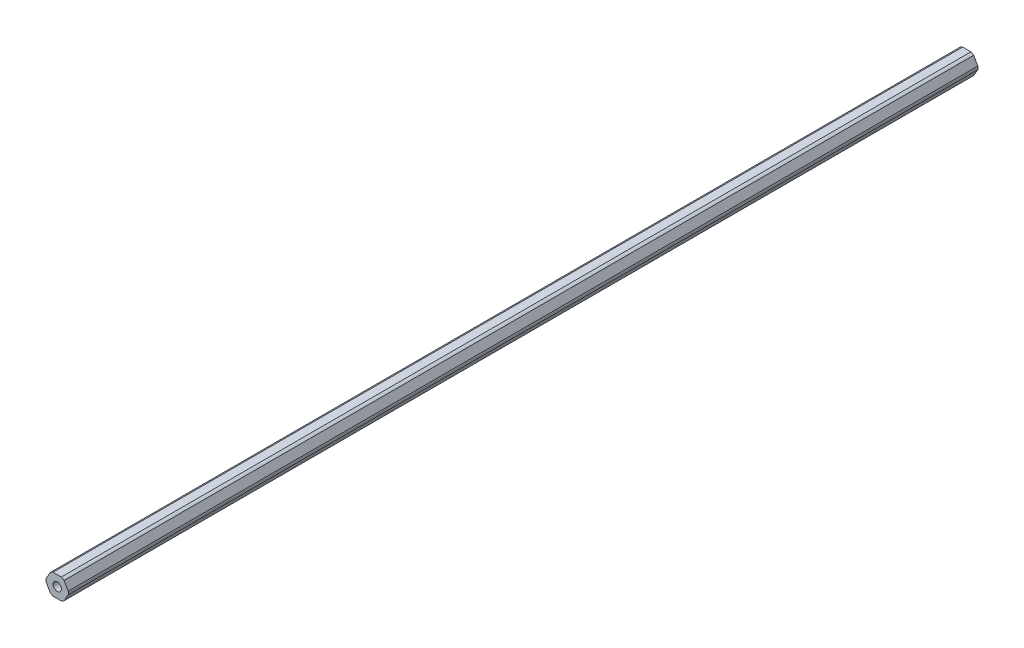
ISO-10303-21;
HEADER;
FILE_DESCRIPTION(('STEP AP214'),'2;1');
FILE_NAME('part.step','',(''),(''),'','','');
FILE_SCHEMA(('AUTOMOTIVE_DESIGN { 1 0 10303 214 1 1 1 1 }'));
ENDSEC;
DATA;
#1=APPLICATION_CONTEXT('core data for automotive mechanical design processes');
#2=APPLICATION_PROTOCOL_DEFINITION('international standard','automotive_design',2000,#1);
#3=PRODUCT_CONTEXT('',#1,'mechanical');
#4=PRODUCT('Part','Part','',(#3));
#5=PRODUCT_RELATED_PRODUCT_CATEGORY('part','',(#4));
#6=PRODUCT_DEFINITION_FORMATION('','',#4);
#7=PRODUCT_DEFINITION_CONTEXT('part definition',#1,'design');
#8=PRODUCT_DEFINITION('design','',#6,#7);
#9=PRODUCT_DEFINITION_SHAPE('','',#8);
#10=(LENGTH_UNIT() NAMED_UNIT(*) SI_UNIT(.MILLI.,.METRE.));
#11=(NAMED_UNIT(*) PLANE_ANGLE_UNIT() SI_UNIT($,.RADIAN.));
#12=(NAMED_UNIT(*) SI_UNIT($,.STERADIAN.) SOLID_ANGLE_UNIT());
#13=UNCERTAINTY_MEASURE_WITH_UNIT(LENGTH_MEASURE(1.E-05),#10,'distance_accuracy_value','');
#14=(GEOMETRIC_REPRESENTATION_CONTEXT(3) GLOBAL_UNCERTAINTY_ASSIGNED_CONTEXT((#13)) GLOBAL_UNIT_ASSIGNED_CONTEXT((#10,
#11,#12)) REPRESENTATION_CONTEXT('',''));
#15=CARTESIAN_POINT('',(0.,0.,0.));
#16=DIRECTION('',(0.,0.,1.));
#17=DIRECTION('',(1.,0.,0.));
#18=AXIS2_PLACEMENT_3D('',#15,#16,#17);
#19=CARTESIAN_POINT('',(0.,0.,-457.2));
#20=DIRECTION('',(0.,0.,1.));
#21=DIRECTION('',(1.,0.,0.));
#22=AXIS2_PLACEMENT_3D('',#19,#20,#21);
#23=CYLINDRICAL_SURFACE('',#22,2.55);
#24=DIRECTION('',(0.,0.,1.));
#25=VECTOR('',#24,1.);
#26=CARTESIAN_POINT('',(-2.55,0.,-457.2));
#27=LINE('',#26,#25);
#28=CARTESIAN_POINT('',(-2.55,0.,-457.2));
#29=VERTEX_POINT('',#28);
#30=CARTESIAN_POINT('',(-2.55,0.,101.6));
#31=VERTEX_POINT('',#30);
#32=EDGE_CURVE('E50',#29,#31,#27,.T.);
#33=ORIENTED_EDGE('',*,*,#32,.T.);
#34=CARTESIAN_POINT('',(0.,0.,101.6));
#35=DIRECTION('',(0.,0.,-1.));
#36=DIRECTION('',(-1.,0.,0.));
#37=AXIS2_PLACEMENT_3D('',#34,#35,#36);
#38=CIRCLE('',#37,2.55);
#39=CARTESIAN_POINT('',(2.55,0.,101.6));
#40=VERTEX_POINT('',#39);
#41=EDGE_CURVE('E64',#31,#40,#38,.F.);
#42=ORIENTED_EDGE('',*,*,#41,.T.);
#43=DIRECTION('',(0.,0.,1.));
#44=VECTOR('',#43,1.);
#45=CARTESIAN_POINT('',(2.55,0.,-457.2));
#46=LINE('',#45,#44);
#47=CARTESIAN_POINT('',(2.55,0.,-457.2));
#48=VERTEX_POINT('',#47);
#49=EDGE_CURVE('E166',#48,#40,#46,.T.);
#50=ORIENTED_EDGE('',*,*,#49,.F.);
#51=CARTESIAN_POINT('',(0.,0.,-457.2));
#52=DIRECTION('',(0.,0.,1.));
#53=DIRECTION('',(1.,0.,0.));
#54=AXIS2_PLACEMENT_3D('',#51,#52,#53);
#55=CIRCLE('',#54,2.55);
#56=EDGE_CURVE('E201',#29,#48,#55,.T.);
#57=ORIENTED_EDGE('',*,*,#56,.F.);
#58=EDGE_LOOP('',(#33,#42,#50,#57));
#59=FACE_BOUND('',#58,.T.);
#60=ADVANCED_FACE('F42',(#59),#23,.F.);
#61=CARTESIAN_POINT('',(0.,0.,-457.2));
#62=DIRECTION('',(0.,0.,1.));
#63=DIRECTION('',(1.,0.,0.));
#64=AXIS2_PLACEMENT_3D('',#61,#62,#63);
#65=CYLINDRICAL_SURFACE('',#64,6.87);
#66=CARTESIAN_POINT('',(0.,0.,101.6));
#67=DIRECTION('',(0.,0.,-1.));
#68=DIRECTION('',(-1.,0.,0.));
#69=AXIS2_PLACEMENT_3D('',#66,#67,#68);
#70=CIRCLE('',#69,6.87);
#71=CARTESIAN_POINT('',(6.80102150534208,-0.971085209378955,101.6));
#72=VERTEX_POINT('',#71);
#73=CARTESIAN_POINT('',(6.87,0.,101.6));
#74=VERTEX_POINT('',#73);
#75=EDGE_CURVE('E317',#72,#74,#70,.F.);
#76=ORIENTED_EDGE('',*,*,#75,.F.);
#77=DIRECTION('',(0.,0.,-1.));
#78=VECTOR('',#77,1.);
#79=CARTESIAN_POINT('',(6.80102150534208,-0.971085209378962,-457.2));
#80=LINE('',#79,#78);
#81=CARTESIAN_POINT('',(6.80102150534208,-0.971085209378955,-457.2));
#82=VERTEX_POINT('',#81);
#83=EDGE_CURVE('E223',#72,#82,#80,.T.);
#84=ORIENTED_EDGE('',*,*,#83,.T.);
#85=CARTESIAN_POINT('',(0.,0.,-457.2));
#86=DIRECTION('',(0.,0.,1.));
#87=DIRECTION('',(1.,0.,0.));
#88=AXIS2_PLACEMENT_3D('',#85,#86,#87);
#89=CIRCLE('',#88,6.87);
#90=CARTESIAN_POINT('',(6.87,0.,-457.2));
#91=VERTEX_POINT('',#90);
#92=EDGE_CURVE('E193',#82,#91,#89,.T.);
#93=ORIENTED_EDGE('',*,*,#92,.T.);
#94=DIRECTION('',(0.,0.,1.));
#95=VECTOR('',#94,1.);
#96=CARTESIAN_POINT('',(6.87,0.,-457.2));
#97=LINE('',#96,#95);
#98=EDGE_CURVE('E225',#91,#74,#97,.T.);
#99=ORIENTED_EDGE('',*,*,#98,.T.);
#100=EDGE_LOOP('',(#76,#84,#93,#99));
#101=FACE_BOUND('',#100,.T.);
#102=ADVANCED_FACE('F350',(#101),#65,.T.);
#103=CARTESIAN_POINT('',(3.68083890619154,-6.3754,457.2));
#104=DIRECTION('',(-0.866025403784439,0.5,0.));
#105=DIRECTION('',(0.,0.,1.));
#106=AXIS2_PLACEMENT_3D('',#103,#104,#105);
#107=PLANE('',#106);
#108=ORIENTED_EDGE('',*,*,#83,.F.);
#109=DIRECTION('',(-0.5,-0.866025403784439,0.));
#110=VECTOR('',#109,1.);
#111=CARTESIAN_POINT('',(3.68083890619154,-6.3754,101.6));
#112=LINE('',#111,#110);
#113=CARTESIAN_POINT('',(4.24149521323254,-5.40431479062105,101.6));
#114=VERTEX_POINT('',#113);
#115=EDGE_CURVE('E324',#72,#114,#112,.T.);
#116=ORIENTED_EDGE('',*,*,#115,.T.);
#117=DIRECTION('',(0.,0.,1.));
#118=VECTOR('',#117,1.);
#119=CARTESIAN_POINT('',(4.24149521323255,-5.40431479062104,-457.2));
#120=LINE('',#119,#118);
#121=CARTESIAN_POINT('',(4.24149521323254,-5.40431479062105,-457.2));
#122=VERTEX_POINT('',#121);
#123=EDGE_CURVE('E237',#122,#114,#120,.T.);
#124=ORIENTED_EDGE('',*,*,#123,.F.);
#125=DIRECTION('',(0.5,0.866025403784439,0.));
#126=VECTOR('',#125,1.);
#127=CARTESIAN_POINT('',(3.68083890619154,-6.3754,-457.2));
#128=LINE('',#127,#126);
#129=EDGE_CURVE('E226',#122,#82,#128,.T.);
#130=ORIENTED_EDGE('',*,*,#129,.T.);
#131=EDGE_LOOP('',(#108,#116,#124,#130));
#132=FACE_BOUND('',#131,.T.);
#133=ADVANCED_FACE('F334',(#132),#107,.F.);
#134=CARTESIAN_POINT('',(7.36167781238308,0.,457.2));
#135=DIRECTION('',(-0.866025403784439,-0.5,0.));
#136=DIRECTION('',(-0.5,0.866025403784439,0.));
#137=AXIS2_PLACEMENT_3D('',#134,#135,#136);
#138=PLANE('',#137);
#139=DIRECTION('',(0.,0.,-1.));
#140=VECTOR('',#139,1.);
#141=CARTESIAN_POINT('',(4.24149521323254,5.40431479062105,-457.2));
#142=LINE('',#141,#140);
#143=CARTESIAN_POINT('',(4.24149521323254,5.40431479062105,101.6));
#144=VERTEX_POINT('',#143);
#145=CARTESIAN_POINT('',(4.24149521323254,5.40431479062105,-457.2));
#146=VERTEX_POINT('',#145);
#147=EDGE_CURVE('E236',#144,#146,#142,.T.);
#148=ORIENTED_EDGE('',*,*,#147,.F.);
#149=DIRECTION('',(0.5,-0.866025403784439,0.));
#150=VECTOR('',#149,1.);
#151=CARTESIAN_POINT('',(7.36167781238308,0.,101.6));
#152=LINE('',#151,#150);
#153=CARTESIAN_POINT('',(6.80102150534208,0.97108520937895,101.6));
#154=VERTEX_POINT('',#153);
#155=EDGE_CURVE('E57',#144,#154,#152,.T.);
#156=ORIENTED_EDGE('',*,*,#155,.T.);
#157=DIRECTION('',(0.,0.,1.));
#158=VECTOR('',#157,1.);
#159=CARTESIAN_POINT('',(6.80102150534208,0.971085209378949,-457.2));
#160=LINE('',#159,#158);
#161=CARTESIAN_POINT('',(6.80102150534208,0.97108520937895,-457.2));
#162=VERTEX_POINT('',#161);
#163=EDGE_CURVE('E241',#162,#154,#160,.T.);
#164=ORIENTED_EDGE('',*,*,#163,.F.);
#165=DIRECTION('',(-0.5,0.866025403784439,0.));
#166=VECTOR('',#165,1.);
#167=CARTESIAN_POINT('',(7.36167781238308,0.,-457.2));
#168=LINE('',#167,#166);
#169=EDGE_CURVE('E212',#162,#146,#168,.T.);
#170=ORIENTED_EDGE('',*,*,#169,.T.);
#171=EDGE_LOOP('',(#148,#156,#164,#170));
#172=FACE_BOUND('',#171,.T.);
#173=ADVANCED_FACE('F295',(#172),#138,.F.);
#174=CARTESIAN_POINT('',(3.68083890619154,6.3754,457.2));
#175=DIRECTION('',(0.,-1.,0.));
#176=DIRECTION('',(0.,0.,-1.));
#177=AXIS2_PLACEMENT_3D('',#174,#175,#176);
#178=PLANE('',#177);
#179=DIRECTION('',(0.,0.,-1.));
#180=VECTOR('',#179,1.);
#181=CARTESIAN_POINT('',(-2.55952629210953,6.3754,-457.2));
#182=LINE('',#181,#180);
#183=CARTESIAN_POINT('',(-2.55952629210953,6.3754,101.6));
#184=VERTEX_POINT('',#183);
#185=CARTESIAN_POINT('',(-2.55952629210953,6.3754,-457.2));
#186=VERTEX_POINT('',#185);
#187=EDGE_CURVE('E194',#184,#186,#182,.T.);
#188=ORIENTED_EDGE('',*,*,#187,.F.);
#189=DIRECTION('',(1.,0.,0.));
#190=VECTOR('',#189,1.);
#191=CARTESIAN_POINT('',(3.68083890619154,6.3754,101.6));
#192=LINE('',#191,#190);
#193=CARTESIAN_POINT('',(2.55952629210953,6.3754,101.6));
#194=VERTEX_POINT('',#193);
#195=EDGE_CURVE('E306',#184,#194,#192,.T.);
#196=ORIENTED_EDGE('',*,*,#195,.T.);
#197=DIRECTION('',(0.,0.,1.));
#198=VECTOR('',#197,1.);
#199=CARTESIAN_POINT('',(2.55952629210952,6.3754,-457.2));
#200=LINE('',#199,#198);
#201=CARTESIAN_POINT('',(2.55952629210952,6.3754,-457.2));
#202=VERTEX_POINT('',#201);
#203=EDGE_CURVE('E175',#202,#194,#200,.T.);
#204=ORIENTED_EDGE('',*,*,#203,.F.);
#205=DIRECTION('',(-1.,0.,0.));
#206=VECTOR('',#205,1.);
#207=CARTESIAN_POINT('',(3.68083890619154,6.3754,-457.2));
#208=LINE('',#207,#206);
#209=EDGE_CURVE('E208',#202,#186,#208,.T.);
#210=ORIENTED_EDGE('',*,*,#209,.T.);
#211=EDGE_LOOP('',(#188,#196,#204,#210));
#212=FACE_BOUND('',#211,.T.);
#213=ADVANCED_FACE('F365',(#212),#178,.F.);
#214=CARTESIAN_POINT('',(-3.68083890619154,6.3754,457.2));
#215=DIRECTION('',(0.866025403784439,-0.5,0.));
#216=DIRECTION('',(0.,0.,-1.));
#217=AXIS2_PLACEMENT_3D('',#214,#215,#216);
#218=PLANE('',#217);
#219=DIRECTION('',(0.,0.,-1.));
#220=VECTOR('',#219,1.);
#221=CARTESIAN_POINT('',(-6.80102150534208,0.97108520937896,-457.2));
#222=LINE('',#221,#220);
#223=CARTESIAN_POINT('',(-6.80102150534207,0.97108520937896,101.6));
#224=VERTEX_POINT('',#223);
#225=CARTESIAN_POINT('',(-6.80102150534208,0.97108520937896,-457.2));
#226=VERTEX_POINT('',#225);
#227=EDGE_CURVE('E218',#224,#226,#222,.T.);
#228=ORIENTED_EDGE('',*,*,#227,.F.);
#229=DIRECTION('',(0.5,0.866025403784439,0.));
#230=VECTOR('',#229,1.);
#231=CARTESIAN_POINT('',(-3.68083890619154,6.3754,101.6));
#232=LINE('',#231,#230);
#233=CARTESIAN_POINT('',(-4.24149521323255,5.40431479062105,101.6));
#234=VERTEX_POINT('',#233);
#235=EDGE_CURVE('E314',#224,#234,#232,.T.);
#236=ORIENTED_EDGE('',*,*,#235,.T.);
#237=DIRECTION('',(0.,0.,1.));
#238=VECTOR('',#237,1.);
#239=CARTESIAN_POINT('',(-4.24149521323255,5.40431479062105,-457.2));
#240=LINE('',#239,#238);
#241=CARTESIAN_POINT('',(-4.24149521323255,5.40431479062105,-457.2));
#242=VERTEX_POINT('',#241);
#243=EDGE_CURVE('E222',#242,#234,#240,.T.);
#244=ORIENTED_EDGE('',*,*,#243,.F.);
#245=DIRECTION('',(-0.5,-0.866025403784439,0.));
#246=VECTOR('',#245,1.);
#247=CARTESIAN_POINT('',(-3.68083890619154,6.3754,-457.2));
#248=LINE('',#247,#246);
#249=EDGE_CURVE('E213',#242,#226,#248,.T.);
#250=ORIENTED_EDGE('',*,*,#249,.T.);
#251=EDGE_LOOP('',(#228,#236,#244,#250));
#252=FACE_BOUND('',#251,.T.);
#253=ADVANCED_FACE('F361',(#252),#218,.F.);
#254=CARTESIAN_POINT('',(-7.36167781238308,0.,457.2));
#255=DIRECTION('',(0.866025403784439,0.5,0.));
#256=DIRECTION('',(0.,0.,-1.));
#257=AXIS2_PLACEMENT_3D('',#254,#255,#256);
#258=PLANE('',#257);
#259=DIRECTION('',(0.,0.,-1.));
#260=VECTOR('',#259,1.);
#261=CARTESIAN_POINT('',(-4.24149521323255,-5.40431479062104,-457.2));
#262=LINE('',#261,#260);
#263=CARTESIAN_POINT('',(-4.24149521323254,-5.40431479062105,101.6));
#264=VERTEX_POINT('',#263);
#265=CARTESIAN_POINT('',(-4.24149521323254,-5.40431479062105,-457.2));
#266=VERTEX_POINT('',#265);
#267=EDGE_CURVE('E206',#264,#266,#262,.T.);
#268=ORIENTED_EDGE('',*,*,#267,.F.);
#269=DIRECTION('',(-0.5,0.866025403784439,0.));
#270=VECTOR('',#269,1.);
#271=CARTESIAN_POINT('',(-7.36167781238308,0.,101.6));
#272=LINE('',#271,#270);
#273=CARTESIAN_POINT('',(-6.80102150534208,-0.971085209378956,101.6));
#274=VERTEX_POINT('',#273);
#275=EDGE_CURVE('E321',#264,#274,#272,.T.);
#276=ORIENTED_EDGE('',*,*,#275,.T.);
#277=DIRECTION('',(0.,0.,1.));
#278=VECTOR('',#277,1.);
#279=CARTESIAN_POINT('',(-6.80102150534208,-0.971085209378962,-457.2));
#280=LINE('',#279,#278);
#281=CARTESIAN_POINT('',(-6.80102150534208,-0.971085209378956,-457.2));
#282=VERTEX_POINT('',#281);
#283=EDGE_CURVE('E196',#282,#274,#280,.T.);
#284=ORIENTED_EDGE('',*,*,#283,.F.);
#285=DIRECTION('',(0.5,-0.866025403784439,0.));
#286=VECTOR('',#285,1.);
#287=CARTESIAN_POINT('',(-7.36167781238308,0.,-457.2));
#288=LINE('',#287,#286);
#289=EDGE_CURVE('E190',#282,#266,#288,.T.);
#290=ORIENTED_EDGE('',*,*,#289,.T.);
#291=EDGE_LOOP('',(#268,#276,#284,#290));
#292=FACE_BOUND('',#291,.T.);
#293=ADVANCED_FACE('F364',(#292),#258,.F.);
#294=CARTESIAN_POINT('',(-3.68083890619154,-6.3754,457.2));
#295=DIRECTION('',(0.,1.,0.));
#296=DIRECTION('',(1.,0.,0.));
#297=AXIS2_PLACEMENT_3D('',#294,#295,#296);
#298=PLANE('',#297);
#299=DIRECTION('',(0.,0.,-1.));
#300=VECTOR('',#299,1.);
#301=CARTESIAN_POINT('',(2.55952629210953,-6.3754,-457.2));
#302=LINE('',#301,#300);
#303=CARTESIAN_POINT('',(2.55952629210953,-6.3754,101.6));
#304=VERTEX_POINT('',#303);
#305=CARTESIAN_POINT('',(2.55952629210953,-6.3754,-457.2));
#306=VERTEX_POINT('',#305);
#307=EDGE_CURVE('E242',#304,#306,#302,.T.);
#308=ORIENTED_EDGE('',*,*,#307,.F.);
#309=DIRECTION('',(-1.,0.,0.));
#310=VECTOR('',#309,1.);
#311=CARTESIAN_POINT('',(-3.68083890619154,-6.3754,101.6));
#312=LINE('',#311,#310);
#313=CARTESIAN_POINT('',(-2.55952629210953,-6.3754,101.6));
#314=VERTEX_POINT('',#313);
#315=EDGE_CURVE('E176',#304,#314,#312,.T.);
#316=ORIENTED_EDGE('',*,*,#315,.T.);
#317=DIRECTION('',(0.,0.,1.));
#318=VECTOR('',#317,1.);
#319=CARTESIAN_POINT('',(-2.55952629210953,-6.3754,-457.2));
#320=LINE('',#319,#318);
#321=CARTESIAN_POINT('',(-2.55952629210953,-6.3754,-457.2));
#322=VERTEX_POINT('',#321);
#323=EDGE_CURVE('E207',#322,#314,#320,.T.);
#324=ORIENTED_EDGE('',*,*,#323,.F.);
#325=DIRECTION('',(1.,0.,0.));
#326=VECTOR('',#325,1.);
#327=CARTESIAN_POINT('',(-3.68083890619154,-6.3754,-457.2));
#328=LINE('',#327,#326);
#329=EDGE_CURVE('E200',#322,#306,#328,.T.);
#330=ORIENTED_EDGE('',*,*,#329,.T.);
#331=EDGE_LOOP('',(#308,#316,#324,#330));
#332=FACE_BOUND('',#331,.T.);
#333=ADVANCED_FACE('F368',(#332),#298,.F.);
#334=CARTESIAN_POINT('',(0.,0.,-457.2));
#335=DIRECTION('',(0.,0.,1.));
#336=DIRECTION('',(1.,0.,0.));
#337=AXIS2_PLACEMENT_3D('',#334,#335,#336);
#338=PLANE('',#337);
#339=CARTESIAN_POINT('',(0.,0.,-457.2));
#340=DIRECTION('',(0.,0.,1.));
#341=DIRECTION('',(1.,0.,0.));
#342=AXIS2_PLACEMENT_3D('',#339,#340,#341);
#343=CIRCLE('',#342,6.87);
#344=EDGE_CURVE('E183',#146,#202,#343,.T.);
#345=ORIENTED_EDGE('',*,*,#344,.F.);
#346=ORIENTED_EDGE('',*,*,#169,.F.);
#347=CARTESIAN_POINT('',(0.,0.,-457.2));
#348=DIRECTION('',(0.,0.,1.));
#349=DIRECTION('',(1.,0.,0.));
#350=AXIS2_PLACEMENT_3D('',#347,#348,#349);
#351=CIRCLE('',#350,6.87);
#352=EDGE_CURVE('E251',#91,#162,#351,.T.);
#353=ORIENTED_EDGE('',*,*,#352,.F.);
#354=ORIENTED_EDGE('',*,*,#92,.F.);
#355=ORIENTED_EDGE('',*,*,#129,.F.);
#356=CARTESIAN_POINT('',(0.,0.,-457.2));
#357=DIRECTION('',(0.,0.,1.));
#358=DIRECTION('',(1.,0.,0.));
#359=AXIS2_PLACEMENT_3D('',#356,#357,#358);
#360=CIRCLE('',#359,6.87);
#361=EDGE_CURVE('E256',#306,#122,#360,.T.);
#362=ORIENTED_EDGE('',*,*,#361,.F.);
#363=ORIENTED_EDGE('',*,*,#329,.F.);
#364=CARTESIAN_POINT('',(0.,0.,-457.2));
#365=DIRECTION('',(0.,0.,1.));
#366=DIRECTION('',(1.,0.,0.));
#367=AXIS2_PLACEMENT_3D('',#364,#365,#366);
#368=CIRCLE('',#367,6.87);
#369=EDGE_CURVE('E202',#266,#322,#368,.T.);
#370=ORIENTED_EDGE('',*,*,#369,.F.);
#371=ORIENTED_EDGE('',*,*,#289,.F.);
#372=CARTESIAN_POINT('',(0.,0.,-457.2));
#373=DIRECTION('',(0.,0.,1.));
#374=DIRECTION('',(1.,0.,0.));
#375=AXIS2_PLACEMENT_3D('',#372,#373,#374);
#376=CIRCLE('',#375,6.87);
#377=EDGE_CURVE('E214',#226,#282,#376,.T.);
#378=ORIENTED_EDGE('',*,*,#377,.F.);
#379=ORIENTED_EDGE('',*,*,#249,.F.);
#380=CARTESIAN_POINT('',(0.,0.,-457.2));
#381=DIRECTION('',(0.,0.,1.));
#382=DIRECTION('',(1.,0.,0.));
#383=AXIS2_PLACEMENT_3D('',#380,#381,#382);
#384=CIRCLE('',#383,6.87);
#385=EDGE_CURVE('E197',#186,#242,#384,.T.);
#386=ORIENTED_EDGE('',*,*,#385,.F.);
#387=ORIENTED_EDGE('',*,*,#209,.F.);
#388=EDGE_LOOP('',(#345,#346,#353,#354,#355,#362,#363,#370,#371,#378,#379,#386,#387));
#389=FACE_BOUND('',#388,.T.);
#390=CARTESIAN_POINT('',(0.,0.,-457.2));
#391=DIRECTION('',(0.,0.,1.));
#392=DIRECTION('',(1.,0.,0.));
#393=AXIS2_PLACEMENT_3D('',#390,#391,#392);
#394=CIRCLE('',#393,2.55);
#395=EDGE_CURVE('E173',#48,#29,#394,.T.);
#396=ORIENTED_EDGE('',*,*,#395,.T.);
#397=ORIENTED_EDGE('',*,*,#56,.T.);
#398=EDGE_LOOP('',(#396,#397));
#399=FACE_BOUND('',#398,.T.);
#400=ADVANCED_FACE('F298',(#389,#399),#338,.F.);
#401=CARTESIAN_POINT('',(0.,0.,-457.2));
#402=DIRECTION('',(0.,0.,1.));
#403=DIRECTION('',(1.,0.,0.));
#404=AXIS2_PLACEMENT_3D('',#401,#402,#403);
#405=CYLINDRICAL_SURFACE('',#404,6.87);
#406=CARTESIAN_POINT('',(0.,0.,101.6));
#407=DIRECTION('',(0.,0.,-1.));
#408=DIRECTION('',(-1.,0.,0.));
#409=AXIS2_PLACEMENT_3D('',#406,#407,#408);
#410=CIRCLE('',#409,6.87);
#411=EDGE_CURVE('E290',#74,#154,#410,.F.);
#412=ORIENTED_EDGE('',*,*,#411,.F.);
#413=ORIENTED_EDGE('',*,*,#98,.F.);
#414=ORIENTED_EDGE('',*,*,#352,.T.);
#415=ORIENTED_EDGE('',*,*,#163,.T.);
#416=EDGE_LOOP('',(#412,#413,#414,#415));
#417=FACE_BOUND('',#416,.T.);
#418=ADVANCED_FACE('F289',(#417),#405,.T.);
#419=CARTESIAN_POINT('',(0.,0.,-457.2));
#420=DIRECTION('',(0.,0.,1.));
#421=DIRECTION('',(1.,0.,0.));
#422=AXIS2_PLACEMENT_3D('',#419,#420,#421);
#423=CYLINDRICAL_SURFACE('',#422,6.87);
#424=CARTESIAN_POINT('',(0.,0.,101.6));
#425=DIRECTION('',(0.,0.,-1.));
#426=DIRECTION('',(-1.,0.,0.));
#427=AXIS2_PLACEMENT_3D('',#424,#425,#426);
#428=CIRCLE('',#427,6.87);
#429=EDGE_CURVE('E186',#304,#114,#428,.F.);
#430=ORIENTED_EDGE('',*,*,#429,.F.);
#431=ORIENTED_EDGE('',*,*,#307,.T.);
#432=ORIENTED_EDGE('',*,*,#361,.T.);
#433=ORIENTED_EDGE('',*,*,#123,.T.);
#434=EDGE_LOOP('',(#430,#431,#432,#433));
#435=FACE_BOUND('',#434,.T.);
#436=ADVANCED_FACE('F336',(#435),#423,.T.);
#437=CARTESIAN_POINT('',(0.,0.,-457.2));
#438=DIRECTION('',(0.,0.,1.));
#439=DIRECTION('',(1.,0.,0.));
#440=AXIS2_PLACEMENT_3D('',#437,#438,#439);
#441=CYLINDRICAL_SURFACE('',#440,6.87);
#442=CARTESIAN_POINT('',(0.,0.,101.6));
#443=DIRECTION('',(0.,0.,-1.));
#444=DIRECTION('',(-1.,0.,0.));
#445=AXIS2_PLACEMENT_3D('',#442,#443,#444);
#446=CIRCLE('',#445,6.87);
#447=EDGE_CURVE('E327',#264,#314,#446,.F.);
#448=ORIENTED_EDGE('',*,*,#447,.F.);
#449=ORIENTED_EDGE('',*,*,#267,.T.);
#450=ORIENTED_EDGE('',*,*,#369,.T.);
#451=ORIENTED_EDGE('',*,*,#323,.T.);
#452=EDGE_LOOP('',(#448,#449,#450,#451));
#453=FACE_BOUND('',#452,.T.);
#454=ADVANCED_FACE('F338',(#453),#441,.T.);
#455=CARTESIAN_POINT('',(0.,0.,-457.2));
#456=DIRECTION('',(0.,0.,1.));
#457=DIRECTION('',(1.,0.,0.));
#458=AXIS2_PLACEMENT_3D('',#455,#456,#457);
#459=CYLINDRICAL_SURFACE('',#458,6.87);
#460=CARTESIAN_POINT('',(0.,0.,101.6));
#461=DIRECTION('',(0.,0.,-1.));
#462=DIRECTION('',(-1.,0.,0.));
#463=AXIS2_PLACEMENT_3D('',#460,#461,#462);
#464=CIRCLE('',#463,6.87);
#465=EDGE_CURVE('E319',#224,#274,#464,.F.);
#466=ORIENTED_EDGE('',*,*,#465,.F.);
#467=ORIENTED_EDGE('',*,*,#227,.T.);
#468=ORIENTED_EDGE('',*,*,#377,.T.);
#469=ORIENTED_EDGE('',*,*,#283,.T.);
#470=EDGE_LOOP('',(#466,#467,#468,#469));
#471=FACE_BOUND('',#470,.T.);
#472=ADVANCED_FACE('F344',(#471),#459,.T.);
#473=CARTESIAN_POINT('',(0.,0.,-457.2));
#474=DIRECTION('',(0.,0.,1.));
#475=DIRECTION('',(1.,0.,0.));
#476=AXIS2_PLACEMENT_3D('',#473,#474,#475);
#477=CYLINDRICAL_SURFACE('',#476,6.87);
#478=CARTESIAN_POINT('',(0.,0.,101.6));
#479=DIRECTION('',(0.,0.,-1.));
#480=DIRECTION('',(-1.,0.,0.));
#481=AXIS2_PLACEMENT_3D('',#478,#479,#480);
#482=CIRCLE('',#481,6.87);
#483=EDGE_CURVE('E311',#184,#234,#482,.F.);
#484=ORIENTED_EDGE('',*,*,#483,.F.);
#485=ORIENTED_EDGE('',*,*,#187,.T.);
#486=ORIENTED_EDGE('',*,*,#385,.T.);
#487=ORIENTED_EDGE('',*,*,#243,.T.);
#488=EDGE_LOOP('',(#484,#485,#486,#487));
#489=FACE_BOUND('',#488,.T.);
#490=ADVANCED_FACE('F44',(#489),#477,.T.);
#491=CARTESIAN_POINT('',(0.,0.,-457.2));
#492=DIRECTION('',(0.,0.,1.));
#493=DIRECTION('',(1.,0.,0.));
#494=AXIS2_PLACEMENT_3D('',#491,#492,#493);
#495=CYLINDRICAL_SURFACE('',#494,6.87);
#496=CARTESIAN_POINT('',(0.,0.,101.6));
#497=DIRECTION('',(0.,0.,-1.));
#498=DIRECTION('',(-1.,0.,0.));
#499=AXIS2_PLACEMENT_3D('',#496,#497,#498);
#500=CIRCLE('',#499,6.87);
#501=EDGE_CURVE('E168',#144,#194,#500,.F.);
#502=ORIENTED_EDGE('',*,*,#501,.F.);
#503=ORIENTED_EDGE('',*,*,#147,.T.);
#504=ORIENTED_EDGE('',*,*,#344,.T.);
#505=ORIENTED_EDGE('',*,*,#203,.T.);
#506=EDGE_LOOP('',(#502,#503,#504,#505));
#507=FACE_BOUND('',#506,.T.);
#508=ADVANCED_FACE('F304',(#507),#495,.T.);
#509=CARTESIAN_POINT('',(0.,0.,-457.2));
#510=DIRECTION('',(0.,0.,1.));
#511=DIRECTION('',(1.,0.,0.));
#512=AXIS2_PLACEMENT_3D('',#509,#510,#511);
#513=CYLINDRICAL_SURFACE('',#512,2.55);
#514=ORIENTED_EDGE('',*,*,#49,.T.);
#515=CARTESIAN_POINT('',(0.,0.,101.6));
#516=DIRECTION('',(0.,0.,-1.));
#517=DIRECTION('',(-1.,0.,0.));
#518=AXIS2_PLACEMENT_3D('',#515,#516,#517);
#519=CIRCLE('',#518,2.55);
#520=EDGE_CURVE('E11',#40,#31,#519,.F.);
#521=ORIENTED_EDGE('',*,*,#520,.T.);
#522=ORIENTED_EDGE('',*,*,#32,.F.);
#523=ORIENTED_EDGE('',*,*,#395,.F.);
#524=EDGE_LOOP('',(#514,#521,#522,#523));
#525=FACE_BOUND('',#524,.T.);
#526=ADVANCED_FACE('F171',(#525),#513,.F.);
#527=CARTESIAN_POINT('',(0.,0.,101.6));
#528=DIRECTION('',(0.,0.,-1.));
#529=DIRECTION('',(-1.,0.,0.));
#530=AXIS2_PLACEMENT_3D('',#527,#528,#529);
#531=PLANE('',#530);
#532=ORIENTED_EDGE('',*,*,#520,.F.);
#533=ORIENTED_EDGE('',*,*,#41,.F.);
#534=EDGE_LOOP('',(#532,#533));
#535=FACE_BOUND('',#534,.T.);
#536=ORIENTED_EDGE('',*,*,#429,.T.);
#537=ORIENTED_EDGE('',*,*,#115,.F.);
#538=ORIENTED_EDGE('',*,*,#75,.T.);
#539=ORIENTED_EDGE('',*,*,#411,.T.);
#540=ORIENTED_EDGE('',*,*,#155,.F.);
#541=ORIENTED_EDGE('',*,*,#501,.T.);
#542=ORIENTED_EDGE('',*,*,#195,.F.);
#543=ORIENTED_EDGE('',*,*,#483,.T.);
#544=ORIENTED_EDGE('',*,*,#235,.F.);
#545=ORIENTED_EDGE('',*,*,#465,.T.);
#546=ORIENTED_EDGE('',*,*,#275,.F.);
#547=ORIENTED_EDGE('',*,*,#447,.T.);
#548=ORIENTED_EDGE('',*,*,#315,.F.);
#549=EDGE_LOOP('',(#536,#537,#538,#539,#540,#541,#542,#543,#544,#545,#546,#547,#548));
#550=FACE_BOUND('',#549,.T.);
#551=ADVANCED_FACE('F160',(#535,#550),#531,.F.);
#552=CLOSED_SHELL('',(#60,#102,#133,#173,#213,#253,#293,#333,#400,#418,#436,#454,#472,#490,#508,
#526,#551));
#553=MANIFOLD_SOLID_BREP('B2',#552);
#554=ADVANCED_BREP_SHAPE_REPRESENTATION('',(#18,#553),#14);
#555=SHAPE_DEFINITION_REPRESENTATION(#9,#554);
ENDSEC;
END-ISO-10303-21;
